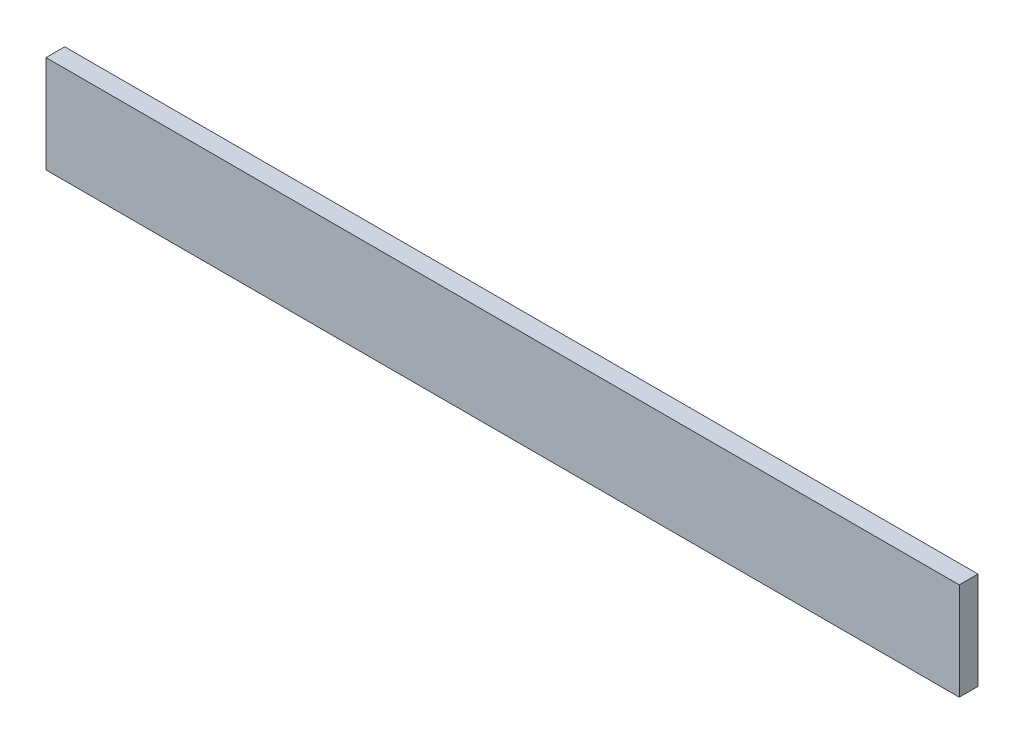
ISO-10303-21;
HEADER;
FILE_DESCRIPTION(('STEP AP214'),'2;1');
FILE_NAME('part.step','',(''),(''),'','','');
FILE_SCHEMA(('AUTOMOTIVE_DESIGN { 1 0 10303 214 1 1 1 1 }'));
ENDSEC;
DATA;
#1=APPLICATION_CONTEXT('core data for automotive mechanical design processes');
#2=APPLICATION_PROTOCOL_DEFINITION('international standard','automotive_design',2000,#1);
#3=PRODUCT_CONTEXT('',#1,'mechanical');
#4=PRODUCT('Part','Part','',(#3));
#5=PRODUCT_RELATED_PRODUCT_CATEGORY('part','',(#4));
#6=PRODUCT_DEFINITION_FORMATION('','',#4);
#7=PRODUCT_DEFINITION_CONTEXT('part definition',#1,'design');
#8=PRODUCT_DEFINITION('design','',#6,#7);
#9=PRODUCT_DEFINITION_SHAPE('','',#8);
#10=(LENGTH_UNIT() NAMED_UNIT(*) SI_UNIT(.MILLI.,.METRE.));
#11=(NAMED_UNIT(*) PLANE_ANGLE_UNIT() SI_UNIT($,.RADIAN.));
#12=(NAMED_UNIT(*) SI_UNIT($,.STERADIAN.) SOLID_ANGLE_UNIT());
#13=UNCERTAINTY_MEASURE_WITH_UNIT(LENGTH_MEASURE(1.E-05),#10,'distance_accuracy_value','');
#14=(GEOMETRIC_REPRESENTATION_CONTEXT(3) GLOBAL_UNCERTAINTY_ASSIGNED_CONTEXT((#13)) GLOBAL_UNIT_ASSIGNED_CONTEXT((#10,
#11,#12)) REPRESENTATION_CONTEXT('',''));
#15=CARTESIAN_POINT('',(0.,0.,0.));
#16=DIRECTION('',(0.,0.,1.));
#17=DIRECTION('',(1.,0.,0.));
#18=AXIS2_PLACEMENT_3D('',#15,#16,#17);
#19=CARTESIAN_POINT('',(0.,0.,50.));
#20=DIRECTION('',(1.,0.,0.));
#21=DIRECTION('',(0.,0.,-1.));
#22=AXIS2_PLACEMENT_3D('',#19,#20,#21);
#23=PLANE('',#22);
#24=DIRECTION('',(0.,-1.,0.));
#25=VECTOR('',#24,1.);
#26=CARTESIAN_POINT('',(0.,0.,0.));
#27=LINE('',#26,#25);
#28=CARTESIAN_POINT('',(0.,260.,0.));
#29=VERTEX_POINT('',#28);
#30=CARTESIAN_POINT('',(0.,0.,0.));
#31=VERTEX_POINT('',#30);
#32=EDGE_CURVE('E99',#29,#31,#27,.T.);
#33=ORIENTED_EDGE('',*,*,#32,.T.);
#34=DIRECTION('',(0.,0.,-1.));
#35=VECTOR('',#34,1.);
#36=CARTESIAN_POINT('',(0.,0.,50.));
#37=LINE('',#36,#35);
#38=CARTESIAN_POINT('',(0.,0.,50.));
#39=VERTEX_POINT('',#38);
#40=EDGE_CURVE('E11',#39,#31,#37,.T.);
#41=ORIENTED_EDGE('',*,*,#40,.F.);
#42=DIRECTION('',(0.,-1.,0.));
#43=VECTOR('',#42,1.);
#44=CARTESIAN_POINT('',(0.,0.,50.));
#45=LINE('',#44,#43);
#46=CARTESIAN_POINT('',(0.,260.,50.));
#47=VERTEX_POINT('',#46);
#48=EDGE_CURVE('E87',#47,#39,#45,.T.);
#49=ORIENTED_EDGE('',*,*,#48,.F.);
#50=DIRECTION('',(0.,0.,-1.));
#51=VECTOR('',#50,1.);
#52=CARTESIAN_POINT('',(0.,260.,50.));
#53=LINE('',#52,#51);
#54=EDGE_CURVE('E95',#47,#29,#53,.T.);
#55=ORIENTED_EDGE('',*,*,#54,.T.);
#56=EDGE_LOOP('',(#33,#41,#49,#55));
#57=FACE_BOUND('',#56,.T.);
#58=ADVANCED_FACE('F36',(#57),#23,.F.);
#59=CARTESIAN_POINT('',(0.,0.,50.));
#60=DIRECTION('',(0.,1.,0.));
#61=DIRECTION('',(0.,0.,1.));
#62=AXIS2_PLACEMENT_3D('',#59,#60,#61);
#63=PLANE('',#62);
#64=DIRECTION('',(1.,0.,0.));
#65=VECTOR('',#64,1.);
#66=CARTESIAN_POINT('',(0.,0.,0.));
#67=LINE('',#66,#65);
#68=CARTESIAN_POINT('',(2440.,0.,0.));
#69=VERTEX_POINT('',#68);
#70=EDGE_CURVE('E91',#31,#69,#67,.T.);
#71=ORIENTED_EDGE('',*,*,#70,.T.);
#72=DIRECTION('',(0.,0.,-1.));
#73=VECTOR('',#72,1.);
#74=CARTESIAN_POINT('',(2440.,0.,50.));
#75=LINE('',#74,#73);
#76=CARTESIAN_POINT('',(2440.,0.,50.));
#77=VERTEX_POINT('',#76);
#78=EDGE_CURVE('E44',#77,#69,#75,.T.);
#79=ORIENTED_EDGE('',*,*,#78,.F.);
#80=DIRECTION('',(1.,0.,0.));
#81=VECTOR('',#80,1.);
#82=CARTESIAN_POINT('',(0.,0.,50.));
#83=LINE('',#82,#81);
#84=EDGE_CURVE('E82',#39,#77,#83,.T.);
#85=ORIENTED_EDGE('',*,*,#84,.F.);
#86=ORIENTED_EDGE('',*,*,#40,.T.);
#87=EDGE_LOOP('',(#71,#79,#85,#86));
#88=FACE_BOUND('',#87,.T.);
#89=ADVANCED_FACE('F90',(#88),#63,.F.);
#90=CARTESIAN_POINT('',(2440.,0.,50.));
#91=DIRECTION('',(-1.,0.,0.));
#92=DIRECTION('',(0.,0.,1.));
#93=AXIS2_PLACEMENT_3D('',#90,#91,#92);
#94=PLANE('',#93);
#95=DIRECTION('',(0.,1.,0.));
#96=VECTOR('',#95,1.);
#97=CARTESIAN_POINT('',(2440.,0.,0.));
#98=LINE('',#97,#96);
#99=CARTESIAN_POINT('',(2440.,260.,0.));
#100=VERTEX_POINT('',#99);
#101=EDGE_CURVE('E69',#69,#100,#98,.T.);
#102=ORIENTED_EDGE('',*,*,#101,.T.);
#103=DIRECTION('',(0.,0.,-1.));
#104=VECTOR('',#103,1.);
#105=CARTESIAN_POINT('',(2440.,260.,50.));
#106=LINE('',#105,#104);
#107=CARTESIAN_POINT('',(2440.,260.,50.));
#108=VERTEX_POINT('',#107);
#109=EDGE_CURVE('E92',#108,#100,#106,.T.);
#110=ORIENTED_EDGE('',*,*,#109,.F.);
#111=DIRECTION('',(0.,1.,0.));
#112=VECTOR('',#111,1.);
#113=CARTESIAN_POINT('',(2440.,0.,50.));
#114=LINE('',#113,#112);
#115=EDGE_CURVE('E85',#77,#108,#114,.T.);
#116=ORIENTED_EDGE('',*,*,#115,.F.);
#117=ORIENTED_EDGE('',*,*,#78,.T.);
#118=EDGE_LOOP('',(#102,#110,#116,#117));
#119=FACE_BOUND('',#118,.T.);
#120=ADVANCED_FACE('F93',(#119),#94,.F.);
#121=CARTESIAN_POINT('',(0.,260.,50.));
#122=DIRECTION('',(0.,-1.,0.));
#123=DIRECTION('',(0.,0.,-1.));
#124=AXIS2_PLACEMENT_3D('',#121,#122,#123);
#125=PLANE('',#124);
#126=DIRECTION('',(-1.,0.,0.));
#127=VECTOR('',#126,1.);
#128=CARTESIAN_POINT('',(0.,260.,0.));
#129=LINE('',#128,#127);
#130=EDGE_CURVE('E75',#100,#29,#129,.T.);
#131=ORIENTED_EDGE('',*,*,#130,.T.);
#132=ORIENTED_EDGE('',*,*,#54,.F.);
#133=DIRECTION('',(-1.,0.,0.));
#134=VECTOR('',#133,1.);
#135=CARTESIAN_POINT('',(0.,260.,50.));
#136=LINE('',#135,#134);
#137=EDGE_CURVE('E52',#108,#47,#136,.T.);
#138=ORIENTED_EDGE('',*,*,#137,.F.);
#139=ORIENTED_EDGE('',*,*,#109,.T.);
#140=EDGE_LOOP('',(#131,#132,#138,#139));
#141=FACE_BOUND('',#140,.T.);
#142=ADVANCED_FACE('F106',(#141),#125,.F.);
#143=CARTESIAN_POINT('',(0.,0.,50.));
#144=DIRECTION('',(0.,0.,-1.));
#145=DIRECTION('',(-1.,0.,0.));
#146=AXIS2_PLACEMENT_3D('',#143,#144,#145);
#147=PLANE('',#146);
#148=ORIENTED_EDGE('',*,*,#48,.T.);
#149=ORIENTED_EDGE('',*,*,#84,.T.);
#150=ORIENTED_EDGE('',*,*,#115,.T.);
#151=ORIENTED_EDGE('',*,*,#137,.T.);
#152=EDGE_LOOP('',(#148,#149,#150,#151));
#153=FACE_BOUND('',#152,.T.);
#154=ADVANCED_FACE('F83',(#153),#147,.F.);
#155=CARTESIAN_POINT('',(0.,0.,0.));
#156=DIRECTION('',(0.,0.,-1.));
#157=DIRECTION('',(-1.,0.,0.));
#158=AXIS2_PLACEMENT_3D('',#155,#156,#157);
#159=PLANE('',#158);
#160=ORIENTED_EDGE('',*,*,#32,.F.);
#161=ORIENTED_EDGE('',*,*,#130,.F.);
#162=ORIENTED_EDGE('',*,*,#101,.F.);
#163=ORIENTED_EDGE('',*,*,#70,.F.);
#164=EDGE_LOOP('',(#160,#161,#162,#163));
#165=FACE_BOUND('',#164,.T.);
#166=ADVANCED_FACE('F109',(#165),#159,.T.);
#167=CLOSED_SHELL('',(#58,#89,#120,#142,#154,#166));
#168=MANIFOLD_SOLID_BREP('B2',#167);
#169=ADVANCED_BREP_SHAPE_REPRESENTATION('',(#18,#168),#14);
#170=SHAPE_DEFINITION_REPRESENTATION(#9,#169);
ENDSEC;
END-ISO-10303-21;
